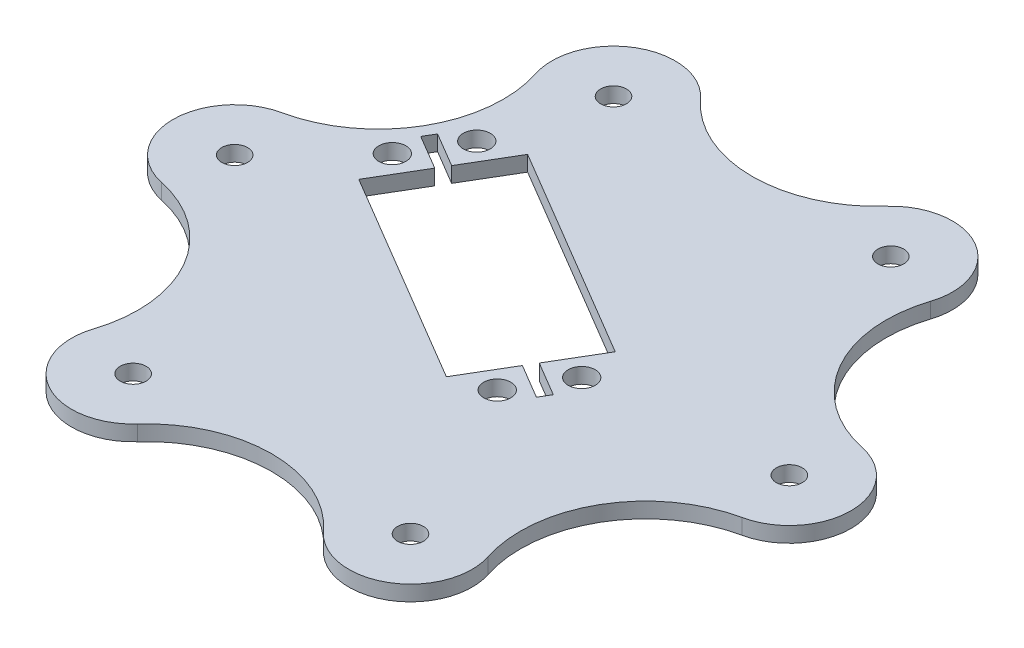
ISO-10303-21;
HEADER;
FILE_DESCRIPTION(('STEP AP214'),'2;1');
FILE_NAME('part.step','',(''),(''),'','','');
FILE_SCHEMA(('AUTOMOTIVE_DESIGN { 1 0 10303 214 1 1 1 1 }'));
ENDSEC;
DATA;
#1=APPLICATION_CONTEXT('core data for automotive mechanical design processes');
#2=APPLICATION_PROTOCOL_DEFINITION('international standard','automotive_design',2000,#1);
#3=PRODUCT_CONTEXT('',#1,'mechanical');
#4=PRODUCT('Part','Part','',(#3));
#5=PRODUCT_RELATED_PRODUCT_CATEGORY('part','',(#4));
#6=PRODUCT_DEFINITION_FORMATION('','',#4);
#7=PRODUCT_DEFINITION_CONTEXT('part definition',#1,'design');
#8=PRODUCT_DEFINITION('design','',#6,#7);
#9=PRODUCT_DEFINITION_SHAPE('','',#8);
#10=(LENGTH_UNIT() NAMED_UNIT(*) SI_UNIT(.MILLI.,.METRE.));
#11=(NAMED_UNIT(*) PLANE_ANGLE_UNIT() SI_UNIT($,.RADIAN.));
#12=(NAMED_UNIT(*) SI_UNIT($,.STERADIAN.) SOLID_ANGLE_UNIT());
#13=UNCERTAINTY_MEASURE_WITH_UNIT(LENGTH_MEASURE(1.E-05),#10,'distance_accuracy_value','');
#14=(GEOMETRIC_REPRESENTATION_CONTEXT(3) GLOBAL_UNCERTAINTY_ASSIGNED_CONTEXT((#13)) GLOBAL_UNIT_ASSIGNED_CONTEXT((#10,
#11,#12)) REPRESENTATION_CONTEXT('',''));
#15=CARTESIAN_POINT('',(0.,0.,0.));
#16=DIRECTION('',(0.,0.,1.));
#17=DIRECTION('',(1.,0.,0.));
#18=AXIS2_PLACEMENT_3D('',#15,#16,#17);
#19=CARTESIAN_POINT('',(-21.3208895512952,-7.5,-23.8559353556927));
#20=DIRECTION('',(-0.860502224298994,0.,-0.509446682172418));
#21=DIRECTION('',(-0.509446682172418,0.,0.860502224298994));
#22=AXIS2_PLACEMENT_3D('',#19,#20,#21);
#23=PLANE('',#22);
#24=DIRECTION('',(-0.509446682172418,0.,0.860502224298994));
#25=VECTOR('',#24,1.);
#26=CARTESIAN_POINT('',(-26.2453178411193,0.,-15.5381238062588));
#27=LINE('',#26,#25);
#28=CARTESIAN_POINT('',(-26.9248030551918,0.,-14.3904108884037));
#29=VERTEX_POINT('',#28);
#30=CARTESIAN_POINT('',(-31.5098231947436,0.,-6.64589086971278));
#31=VERTEX_POINT('',#30);
#32=EDGE_CURVE('E507',#29,#31,#27,.T.);
#33=ORIENTED_EDGE('',*,*,#32,.F.);
#34=DIRECTION('',(0.,1.,0.));
#35=VECTOR('',#34,1.);
#36=CARTESIAN_POINT('',(-26.9248030551918,-7.5,-14.3904108884037));
#37=LINE('',#36,#35);
#38=CARTESIAN_POINT('',(-26.9248030551918,2.5,-14.3904108884037));
#39=VERTEX_POINT('',#38);
#40=EDGE_CURVE('E267',#29,#39,#37,.T.);
#41=ORIENTED_EDGE('',*,*,#40,.T.);
#42=DIRECTION('',(-0.509446682172418,0.,0.860502224298993));
#43=VECTOR('',#42,1.);
#44=CARTESIAN_POINT('',(-21.3208895512952,2.5,-23.8559353556927));
#45=LINE('',#44,#43);
#46=CARTESIAN_POINT('',(-31.5098231947436,2.5,-6.64589086971278));
#47=VERTEX_POINT('',#46);
#48=EDGE_CURVE('E294',#39,#47,#45,.T.);
#49=ORIENTED_EDGE('',*,*,#48,.T.);
#50=DIRECTION('',(0.,1.,0.));
#51=VECTOR('',#50,1.);
#52=CARTESIAN_POINT('',(-31.5098231947436,-7.5,-6.64589086971278));
#53=LINE('',#52,#51);
#54=EDGE_CURVE('E306',#31,#47,#53,.T.);
#55=ORIENTED_EDGE('',*,*,#54,.F.);
#56=EDGE_LOOP('',(#33,#41,#49,#55));
#57=FACE_BOUND('',#56,.T.);
#58=ADVANCED_FACE('F46',(#57),#23,.F.);
#59=CARTESIAN_POINT('',(3.34051688936566,-7.5,13.9866997582702));
#60=DIRECTION('',(0.860502224298993,0.,0.509446682172418));
#61=DIRECTION('',(0.509446682172418,0.,-0.860502224298993));
#62=AXIS2_PLACEMENT_3D('',#59,#60,#61);
#63=PLANE('',#62);
#64=DIRECTION('',(0.509446682172418,0.,-0.860502224298993));
#65=VECTOR('',#64,1.);
#66=CARTESIAN_POINT('',(3.34051688936566,2.5,13.9866997582702));
#67=LINE('',#66,#65);
#68=CARTESIAN_POINT('',(3.34051688936566,2.5,13.9866997582702));
#69=VERTEX_POINT('',#68);
#70=CARTESIAN_POINT('',(7.92553702891743,2.5,6.2421797395792));
#71=VERTEX_POINT('',#70);
#72=EDGE_CURVE('E299',#69,#71,#67,.T.);
#73=ORIENTED_EDGE('',*,*,#72,.T.);
#74=DIRECTION('',(0.,-1.,0.));
#75=VECTOR('',#74,1.);
#76=CARTESIAN_POINT('',(7.92553702891743,-7.5,6.2421797395792));
#77=LINE('',#76,#75);
#78=CARTESIAN_POINT('',(7.92553702891743,0.,6.2421797395792));
#79=VERTEX_POINT('',#78);
#80=EDGE_CURVE('E226',#71,#79,#77,.T.);
#81=ORIENTED_EDGE('',*,*,#80,.T.);
#82=DIRECTION('',(0.509446682172418,0.,-0.860502224298993));
#83=VECTOR('',#82,1.);
#84=CARTESIAN_POINT('',(8.60502224298993,0.,5.09446682172418));
#85=LINE('',#84,#83);
#86=CARTESIAN_POINT('',(3.34051688936566,0.,13.9866997582702));
#87=VERTEX_POINT('',#86);
#88=EDGE_CURVE('E499',#87,#79,#85,.T.);
#89=ORIENTED_EDGE('',*,*,#88,.F.);
#90=DIRECTION('',(0.,1.,0.));
#91=VECTOR('',#90,1.);
#92=CARTESIAN_POINT('',(3.34051688936566,-7.5,13.9866997582702));
#93=LINE('',#92,#91);
#94=EDGE_CURVE('E315',#87,#69,#93,.T.);
#95=ORIENTED_EDGE('',*,*,#94,.T.);
#96=EDGE_LOOP('',(#73,#81,#89,#95));
#97=FACE_BOUND('',#96,.T.);
#98=ADVANCED_FACE('F538',(#97),#63,.F.);
#99=CARTESIAN_POINT('',(-51.3411410143718,2.5,29.6418215851493));
#100=DIRECTION('',(0.,-1.,0.));
#101=DIRECTION('',(0.,0.,-1.));
#102=AXIS2_PLACEMENT_3D('',#99,#100,#101);
#103=CYLINDRICAL_SURFACE('',#102,20.3125000000001);
#104=CARTESIAN_POINT('',(-51.3411410143718,0.,29.6418215851493));
#105=DIRECTION('',(0.,1.,0.));
#106=DIRECTION('',(0.,0.,1.));
#107=AXIS2_PLACEMENT_3D('',#104,#105,#106);
#108=CIRCLE('',#107,20.3125000000001);
#109=CARTESIAN_POINT('',(-32.0146032212363,0.,35.8934288329304));
#110=VERTEX_POINT('',#109);
#111=CARTESIAN_POINT('',(-47.0919228088649,0.,9.77874526520353));
#112=VERTEX_POINT('',#111);
#113=EDGE_CURVE('E365',#110,#112,#108,.T.);
#114=ORIENTED_EDGE('',*,*,#113,.F.);
#115=DIRECTION('',(0.,-1.,0.));
#116=VECTOR('',#115,1.);
#117=CARTESIAN_POINT('',(-32.0146032212363,2.5,35.8934288329304));
#118=LINE('',#117,#116);
#119=CARTESIAN_POINT('',(-32.0146032212363,2.5,35.8934288329304));
#120=VERTEX_POINT('',#119);
#121=EDGE_CURVE('E491',#120,#110,#118,.T.);
#122=ORIENTED_EDGE('',*,*,#121,.F.);
#123=CARTESIAN_POINT('',(-51.3411410143718,2.5,29.6418215851493));
#124=DIRECTION('',(0.,1.,0.));
#125=DIRECTION('',(0.,0.,1.));
#126=AXIS2_PLACEMENT_3D('',#123,#124,#125);
#127=CIRCLE('',#126,20.3125000000001);
#128=CARTESIAN_POINT('',(-47.0919228088649,2.5,9.77874526520353));
#129=VERTEX_POINT('',#128);
#130=EDGE_CURVE('E369',#120,#129,#127,.T.);
#131=ORIENTED_EDGE('',*,*,#130,.T.);
#132=DIRECTION('',(0.,-1.,0.));
#133=VECTOR('',#132,1.);
#134=CARTESIAN_POINT('',(-47.0919228088649,2.5,9.77874526520353));
#135=LINE('',#134,#133);
#136=EDGE_CURVE('E412',#129,#112,#135,.T.);
#137=ORIENTED_EDGE('',*,*,#136,.T.);
#138=EDGE_LOOP('',(#114,#122,#131,#137));
#139=FACE_BOUND('',#138,.T.);
#140=ADVANCED_FACE('F48',(#139),#103,.F.);
#141=CARTESIAN_POINT('',(-22.5000000000004,2.5,38.9711431702995));
#142=DIRECTION('',(0.,-1.,0.));
#143=DIRECTION('',(0.,0.,-1.));
#144=AXIS2_PLACEMENT_3D('',#141,#142,#143);
#145=CYLINDRICAL_SURFACE('',#144,10.);
#146=CARTESIAN_POINT('',(-22.5000000000004,0.,38.9711431702995));
#147=DIRECTION('',(0.,1.,0.));
#148=DIRECTION('',(0.,0.,1.));
#149=AXIS2_PLACEMENT_3D('',#146,#147,#148);
#150=CIRCLE('',#149,10.);
#151=CARTESIAN_POINT('',(-15.0773195876293,0.,45.6721740981347));
#152=VERTEX_POINT('',#151);
#153=EDGE_CURVE('E416',#110,#152,#150,.T.);
#154=ORIENTED_EDGE('',*,*,#153,.T.);
#155=DIRECTION('',(0.,-1.,0.));
#156=VECTOR('',#155,1.);
#157=CARTESIAN_POINT('',(-15.0773195876293,2.5,45.6721740981347));
#158=LINE('',#157,#156);
#159=CARTESIAN_POINT('',(-15.0773195876293,2.5,45.6721740981347));
#160=VERTEX_POINT('',#159);
#161=EDGE_CURVE('E488',#160,#152,#158,.T.);
#162=ORIENTED_EDGE('',*,*,#161,.F.);
#163=CARTESIAN_POINT('',(-22.5000000000004,2.5,38.9711431702995));
#164=DIRECTION('',(0.,1.,0.));
#165=DIRECTION('',(0.,0.,1.));
#166=AXIS2_PLACEMENT_3D('',#163,#164,#165);
#167=CIRCLE('',#166,10.);
#168=EDGE_CURVE('E373',#120,#160,#167,.T.);
#169=ORIENTED_EDGE('',*,*,#168,.F.);
#170=ORIENTED_EDGE('',*,*,#121,.T.);
#171=EDGE_LOOP('',(#154,#162,#169,#170));
#172=FACE_BOUND('',#171,.T.);
#173=ADVANCED_FACE('F666',(#172),#145,.T.);
#174=CARTESIAN_POINT('',(-5.34294830600857E-13,2.5,59.2836431702998));
#175=DIRECTION('',(0.,-1.,0.));
#176=DIRECTION('',(0.,0.,-1.));
#177=AXIS2_PLACEMENT_3D('',#174,#175,#176);
#178=CYLINDRICAL_SURFACE('',#177,20.3125);
#179=CARTESIAN_POINT('',(-5.34294830600857E-13,0.,59.2836431702998));
#180=DIRECTION('',(0.,1.,0.));
#181=DIRECTION('',(0.,0.,1.));
#182=AXIS2_PLACEMENT_3D('',#179,#180,#181);
#183=CIRCLE('',#182,20.3125);
#184=CARTESIAN_POINT('',(15.0773195876285,0.,45.6721740981349));
#185=VERTEX_POINT('',#184);
#186=EDGE_CURVE('E420',#185,#152,#183,.T.);
#187=ORIENTED_EDGE('',*,*,#186,.F.);
#188=DIRECTION('',(0.,-1.,0.));
#189=VECTOR('',#188,1.);
#190=CARTESIAN_POINT('',(15.0773195876285,2.5,45.6721740981349));
#191=LINE('',#190,#189);
#192=CARTESIAN_POINT('',(15.0773195876285,2.5,45.6721740981349));
#193=VERTEX_POINT('',#192);
#194=EDGE_CURVE('E485',#193,#185,#191,.T.);
#195=ORIENTED_EDGE('',*,*,#194,.F.);
#196=CARTESIAN_POINT('',(-5.34294830600857E-13,2.5,59.2836431702998));
#197=DIRECTION('',(0.,1.,0.));
#198=DIRECTION('',(0.,0.,1.));
#199=AXIS2_PLACEMENT_3D('',#196,#197,#198);
#200=CIRCLE('',#199,20.3125);
#201=EDGE_CURVE('E377',#193,#160,#200,.T.);
#202=ORIENTED_EDGE('',*,*,#201,.T.);
#203=ORIENTED_EDGE('',*,*,#161,.T.);
#204=EDGE_LOOP('',(#187,#195,#202,#203));
#205=FACE_BOUND('',#204,.T.);
#206=ADVANCED_FACE('F663',(#205),#178,.F.);
#207=CARTESIAN_POINT('',(22.4999999999997,2.5,38.9711431702999));
#208=DIRECTION('',(0.,-1.,0.));
#209=DIRECTION('',(0.,0.,-1.));
#210=AXIS2_PLACEMENT_3D('',#207,#208,#209);
#211=CYLINDRICAL_SURFACE('',#210,10.);
#212=CARTESIAN_POINT('',(22.4999999999997,0.,38.9711431702999));
#213=DIRECTION('',(0.,1.,0.));
#214=DIRECTION('',(0.,0.,1.));
#215=AXIS2_PLACEMENT_3D('',#212,#213,#214);
#216=CIRCLE('',#215,10.);
#217=CARTESIAN_POINT('',(32.0146032212357,0.,35.8934288329309));
#218=VERTEX_POINT('',#217);
#219=EDGE_CURVE('E424',#185,#218,#216,.T.);
#220=ORIENTED_EDGE('',*,*,#219,.T.);
#221=DIRECTION('',(0.,-1.,0.));
#222=VECTOR('',#221,1.);
#223=CARTESIAN_POINT('',(32.0146032212357,2.5,35.8934288329309));
#224=LINE('',#223,#222);
#225=CARTESIAN_POINT('',(32.0146032212357,2.5,35.8934288329309));
#226=VERTEX_POINT('',#225);
#227=EDGE_CURVE('E482',#226,#218,#224,.T.);
#228=ORIENTED_EDGE('',*,*,#227,.F.);
#229=CARTESIAN_POINT('',(22.4999999999997,2.5,38.9711431702999));
#230=DIRECTION('',(0.,1.,0.));
#231=DIRECTION('',(0.,0.,1.));
#232=AXIS2_PLACEMENT_3D('',#229,#230,#231);
#233=CIRCLE('',#232,10.);
#234=EDGE_CURVE('E381',#193,#226,#233,.T.);
#235=ORIENTED_EDGE('',*,*,#234,.F.);
#236=ORIENTED_EDGE('',*,*,#194,.T.);
#237=EDGE_LOOP('',(#220,#228,#235,#236));
#238=FACE_BOUND('',#237,.T.);
#239=ADVANCED_FACE('F659',(#238),#211,.T.);
#240=CARTESIAN_POINT('',(51.3411410143713,2.5,29.6418215851502));
#241=DIRECTION('',(0.,-1.,0.));
#242=DIRECTION('',(0.,0.,-1.));
#243=AXIS2_PLACEMENT_3D('',#240,#241,#242);
#244=CYLINDRICAL_SURFACE('',#243,20.3125);
#245=CARTESIAN_POINT('',(51.3411410143713,0.,29.6418215851502));
#246=DIRECTION('',(0.,1.,0.));
#247=DIRECTION('',(0.,0.,1.));
#248=AXIS2_PLACEMENT_3D('',#245,#246,#247);
#249=CIRCLE('',#248,20.3125);
#250=CARTESIAN_POINT('',(47.0919228088647,0.,9.77874526520433));
#251=VERTEX_POINT('',#250);
#252=EDGE_CURVE('E428',#251,#218,#249,.T.);
#253=ORIENTED_EDGE('',*,*,#252,.F.);
#254=DIRECTION('',(0.,-1.,0.));
#255=VECTOR('',#254,1.);
#256=CARTESIAN_POINT('',(47.0919228088647,2.5,9.77874526520433));
#257=LINE('',#256,#255);
#258=CARTESIAN_POINT('',(47.0919228088647,2.5,9.77874526520433));
#259=VERTEX_POINT('',#258);
#260=EDGE_CURVE('E479',#259,#251,#257,.T.);
#261=ORIENTED_EDGE('',*,*,#260,.F.);
#262=CARTESIAN_POINT('',(51.3411410143713,2.5,29.6418215851502));
#263=DIRECTION('',(0.,1.,0.));
#264=DIRECTION('',(0.,0.,1.));
#265=AXIS2_PLACEMENT_3D('',#262,#263,#264);
#266=CIRCLE('',#265,20.3125);
#267=EDGE_CURVE('E384',#259,#226,#266,.T.);
#268=ORIENTED_EDGE('',*,*,#267,.T.);
#269=ORIENTED_EDGE('',*,*,#227,.T.);
#270=EDGE_LOOP('',(#253,#261,#268,#269));
#271=FACE_BOUND('',#270,.T.);
#272=ADVANCED_FACE('F655',(#271),#244,.F.);
#273=CARTESIAN_POINT('',(45.,2.5,2.22044604925031E-13));
#274=DIRECTION('',(0.,-1.,0.));
#275=DIRECTION('',(0.,0.,-1.));
#276=AXIS2_PLACEMENT_3D('',#273,#274,#275);
#277=CYLINDRICAL_SURFACE('',#276,10.);
#278=CARTESIAN_POINT('',(45.,0.,2.22044604925031E-13));
#279=DIRECTION('',(0.,1.,0.));
#280=DIRECTION('',(0.,0.,1.));
#281=AXIS2_PLACEMENT_3D('',#278,#279,#280);
#282=CIRCLE('',#281,10.);
#283=CARTESIAN_POINT('',(47.0919228088649,0.,-9.77874526520385));
#284=VERTEX_POINT('',#283);
#285=EDGE_CURVE('E432',#251,#284,#282,.T.);
#286=ORIENTED_EDGE('',*,*,#285,.T.);
#287=DIRECTION('',(0.,-1.,0.));
#288=VECTOR('',#287,1.);
#289=CARTESIAN_POINT('',(47.0919228088649,2.5,-9.77874526520385));
#290=LINE('',#289,#288);
#291=CARTESIAN_POINT('',(47.0919228088649,2.5,-9.77874526520385));
#292=VERTEX_POINT('',#291);
#293=EDGE_CURVE('E476',#292,#284,#290,.T.);
#294=ORIENTED_EDGE('',*,*,#293,.F.);
#295=CARTESIAN_POINT('',(45.,2.5,2.22044604925031E-13));
#296=DIRECTION('',(0.,1.,0.));
#297=DIRECTION('',(0.,0.,1.));
#298=AXIS2_PLACEMENT_3D('',#295,#296,#297);
#299=CIRCLE('',#298,10.);
#300=EDGE_CURVE('E388',#259,#292,#299,.T.);
#301=ORIENTED_EDGE('',*,*,#300,.F.);
#302=ORIENTED_EDGE('',*,*,#260,.T.);
#303=EDGE_LOOP('',(#286,#294,#301,#302));
#304=FACE_BOUND('',#303,.T.);
#305=ADVANCED_FACE('F651',(#304),#277,.T.);
#306=CARTESIAN_POINT('',(51.3411410143716,2.5,-29.6418215851497));
#307=DIRECTION('',(0.,-1.,0.));
#308=DIRECTION('',(0.,0.,-1.));
#309=AXIS2_PLACEMENT_3D('',#306,#307,#308);
#310=CYLINDRICAL_SURFACE('',#309,20.3125000000001);
#311=CARTESIAN_POINT('',(51.3411410143716,0.,-29.6418215851497));
#312=DIRECTION('',(0.,1.,0.));
#313=DIRECTION('',(0.,0.,1.));
#314=AXIS2_PLACEMENT_3D('',#311,#312,#313);
#315=CIRCLE('',#314,20.3125000000001);
#316=CARTESIAN_POINT('',(32.014603221236,0.,-35.8934288329306));
#317=VERTEX_POINT('',#316);
#318=EDGE_CURVE('E436',#317,#284,#315,.T.);
#319=ORIENTED_EDGE('',*,*,#318,.F.);
#320=DIRECTION('',(0.,-1.,0.));
#321=VECTOR('',#320,1.);
#322=CARTESIAN_POINT('',(32.014603221236,2.5,-35.8934288329306));
#323=LINE('',#322,#321);
#324=CARTESIAN_POINT('',(32.014603221236,2.5,-35.8934288329306));
#325=VERTEX_POINT('',#324);
#326=EDGE_CURVE('E473',#325,#317,#323,.T.);
#327=ORIENTED_EDGE('',*,*,#326,.F.);
#328=CARTESIAN_POINT('',(51.3411410143716,2.5,-29.6418215851497));
#329=DIRECTION('',(0.,1.,0.));
#330=DIRECTION('',(0.,0.,1.));
#331=AXIS2_PLACEMENT_3D('',#328,#329,#330);
#332=CIRCLE('',#331,20.3125000000001);
#333=EDGE_CURVE('E391',#325,#292,#332,.T.);
#334=ORIENTED_EDGE('',*,*,#333,.T.);
#335=ORIENTED_EDGE('',*,*,#293,.T.);
#336=EDGE_LOOP('',(#319,#327,#334,#335));
#337=FACE_BOUND('',#336,.T.);
#338=ADVANCED_FACE('F647',(#337),#310,.F.);
#339=CARTESIAN_POINT('',(22.5000000000001,2.5,-38.9711431702997));
#340=DIRECTION('',(0.,-1.,0.));
#341=DIRECTION('',(0.,0.,-1.));
#342=AXIS2_PLACEMENT_3D('',#339,#340,#341);
#343=CYLINDRICAL_SURFACE('',#342,10.);
#344=CARTESIAN_POINT('',(22.5000000000001,0.,-38.9711431702997));
#345=DIRECTION('',(0.,1.,0.));
#346=DIRECTION('',(0.,0.,1.));
#347=AXIS2_PLACEMENT_3D('',#344,#345,#346);
#348=CIRCLE('',#347,10.);
#349=CARTESIAN_POINT('',(15.077319587629,0.,-45.6721740981348));
#350=VERTEX_POINT('',#349);
#351=EDGE_CURVE('E440',#317,#350,#348,.T.);
#352=ORIENTED_EDGE('',*,*,#351,.T.);
#353=DIRECTION('',(0.,-1.,0.));
#354=VECTOR('',#353,1.);
#355=CARTESIAN_POINT('',(15.077319587629,2.5,-45.6721740981348));
#356=LINE('',#355,#354);
#357=CARTESIAN_POINT('',(15.077319587629,2.5,-45.6721740981348));
#358=VERTEX_POINT('',#357);
#359=EDGE_CURVE('E470',#358,#350,#356,.T.);
#360=ORIENTED_EDGE('',*,*,#359,.F.);
#361=CARTESIAN_POINT('',(22.5000000000001,2.5,-38.9711431702997));
#362=DIRECTION('',(0.,1.,0.));
#363=DIRECTION('',(0.,0.,1.));
#364=AXIS2_PLACEMENT_3D('',#361,#362,#363);
#365=CIRCLE('',#364,10.);
#366=EDGE_CURVE('E395',#325,#358,#365,.T.);
#367=ORIENTED_EDGE('',*,*,#366,.F.);
#368=ORIENTED_EDGE('',*,*,#326,.T.);
#369=EDGE_LOOP('',(#352,#360,#367,#368));
#370=FACE_BOUND('',#369,.T.);
#371=ADVANCED_FACE('F643',(#370),#343,.T.);
#372=CARTESIAN_POINT('',(1.21430643318376E-13,2.5,-59.2836431702998));
#373=DIRECTION('',(0.,-1.,0.));
#374=DIRECTION('',(0.,0.,-1.));
#375=AXIS2_PLACEMENT_3D('',#372,#373,#374);
#376=CYLINDRICAL_SURFACE('',#375,20.3125);
#377=CARTESIAN_POINT('',(1.21430643318376E-13,0.,-59.2836431702998));
#378=DIRECTION('',(0.,1.,0.));
#379=DIRECTION('',(0.,0.,1.));
#380=AXIS2_PLACEMENT_3D('',#377,#378,#379);
#381=CIRCLE('',#380,20.3125);
#382=CARTESIAN_POINT('',(-15.0773195876288,0.,-45.6721740981348));
#383=VERTEX_POINT('',#382);
#384=EDGE_CURVE('E444',#383,#350,#381,.T.);
#385=ORIENTED_EDGE('',*,*,#384,.F.);
#386=DIRECTION('',(0.,-1.,0.));
#387=VECTOR('',#386,1.);
#388=CARTESIAN_POINT('',(-15.0773195876288,2.5,-45.6721740981348));
#389=LINE('',#388,#387);
#390=CARTESIAN_POINT('',(-15.0773195876288,2.5,-45.6721740981348));
#391=VERTEX_POINT('',#390);
#392=EDGE_CURVE('E467',#391,#383,#389,.T.);
#393=ORIENTED_EDGE('',*,*,#392,.F.);
#394=CARTESIAN_POINT('',(1.21430643318376E-13,2.5,-59.2836431702998));
#395=DIRECTION('',(0.,1.,0.));
#396=DIRECTION('',(0.,0.,1.));
#397=AXIS2_PLACEMENT_3D('',#394,#395,#396);
#398=CIRCLE('',#397,20.3125);
#399=EDGE_CURVE('E398',#391,#358,#398,.T.);
#400=ORIENTED_EDGE('',*,*,#399,.T.);
#401=ORIENTED_EDGE('',*,*,#359,.T.);
#402=EDGE_LOOP('',(#385,#393,#400,#401));
#403=FACE_BOUND('',#402,.T.);
#404=ADVANCED_FACE('F639',(#403),#376,.F.);
#405=CARTESIAN_POINT('',(-22.5,2.5,-38.9711431702998));
#406=DIRECTION('',(0.,-1.,0.));
#407=DIRECTION('',(0.,0.,-1.));
#408=AXIS2_PLACEMENT_3D('',#405,#406,#407);
#409=CYLINDRICAL_SURFACE('',#408,10.);
#410=CARTESIAN_POINT('',(-22.5,0.,-38.9711431702998));
#411=DIRECTION('',(0.,1.,0.));
#412=DIRECTION('',(0.,0.,1.));
#413=AXIS2_PLACEMENT_3D('',#410,#411,#412);
#414=CIRCLE('',#413,10.);
#415=CARTESIAN_POINT('',(-32.0146032212359,0.,-35.8934288329307));
#416=VERTEX_POINT('',#415);
#417=EDGE_CURVE('E448',#383,#416,#414,.T.);
#418=ORIENTED_EDGE('',*,*,#417,.T.);
#419=DIRECTION('',(0.,-1.,0.));
#420=VECTOR('',#419,1.);
#421=CARTESIAN_POINT('',(-32.0146032212359,2.5,-35.8934288329307));
#422=LINE('',#421,#420);
#423=CARTESIAN_POINT('',(-32.0146032212359,2.5,-35.8934288329307));
#424=VERTEX_POINT('',#423);
#425=EDGE_CURVE('E464',#424,#416,#422,.T.);
#426=ORIENTED_EDGE('',*,*,#425,.F.);
#427=CARTESIAN_POINT('',(-22.5,2.5,-38.9711431702998));
#428=DIRECTION('',(0.,1.,0.));
#429=DIRECTION('',(0.,0.,1.));
#430=AXIS2_PLACEMENT_3D('',#427,#428,#429);
#431=CIRCLE('',#430,10.);
#432=EDGE_CURVE('E402',#391,#424,#431,.T.);
#433=ORIENTED_EDGE('',*,*,#432,.F.);
#434=ORIENTED_EDGE('',*,*,#392,.T.);
#435=EDGE_LOOP('',(#418,#426,#433,#434));
#436=FACE_BOUND('',#435,.T.);
#437=ADVANCED_FACE('F635',(#436),#409,.T.);
#438=CARTESIAN_POINT('',(-51.3411410143715,2.5,-29.6418215851499));
#439=DIRECTION('',(0.,-1.,0.));
#440=DIRECTION('',(0.,0.,-1.));
#441=AXIS2_PLACEMENT_3D('',#438,#439,#440);
#442=CYLINDRICAL_SURFACE('',#441,20.3125);
#443=CARTESIAN_POINT('',(-51.3411410143715,0.,-29.6418215851499));
#444=DIRECTION('',(0.,1.,0.));
#445=DIRECTION('',(0.,0.,1.));
#446=AXIS2_PLACEMENT_3D('',#443,#444,#445);
#447=CIRCLE('',#446,20.3125);
#448=CARTESIAN_POINT('',(-47.0919228088648,0.,-9.77874526520452));
#449=VERTEX_POINT('',#448);
#450=EDGE_CURVE('E452',#449,#416,#447,.T.);
#451=ORIENTED_EDGE('',*,*,#450,.F.);
#452=DIRECTION('',(0.,-1.,0.));
#453=VECTOR('',#452,1.);
#454=CARTESIAN_POINT('',(-47.0919228088648,2.5,-9.77874526520452));
#455=LINE('',#454,#453);
#456=CARTESIAN_POINT('',(-47.0919228088648,2.5,-9.77874526520452));
#457=VERTEX_POINT('',#456);
#458=EDGE_CURVE('E461',#457,#449,#455,.T.);
#459=ORIENTED_EDGE('',*,*,#458,.F.);
#460=CARTESIAN_POINT('',(-51.3411410143715,2.5,-29.6418215851499));
#461=DIRECTION('',(0.,1.,0.));
#462=DIRECTION('',(0.,0.,1.));
#463=AXIS2_PLACEMENT_3D('',#460,#461,#462);
#464=CIRCLE('',#463,20.3125);
#465=EDGE_CURVE('E405',#457,#424,#464,.T.);
#466=ORIENTED_EDGE('',*,*,#465,.T.);
#467=ORIENTED_EDGE('',*,*,#425,.T.);
#468=EDGE_LOOP('',(#451,#459,#466,#467));
#469=FACE_BOUND('',#468,.T.);
#470=ADVANCED_FACE('F631',(#469),#442,.F.);
#471=CARTESIAN_POINT('',(-45.,2.5,-5.27355936696949E-13));
#472=DIRECTION('',(0.,-1.,0.));
#473=DIRECTION('',(0.,0.,-1.));
#474=AXIS2_PLACEMENT_3D('',#471,#472,#473);
#475=CYLINDRICAL_SURFACE('',#474,10.);
#476=CARTESIAN_POINT('',(-45.,0.,-5.27355936696949E-13));
#477=DIRECTION('',(0.,1.,0.));
#478=DIRECTION('',(0.,0.,1.));
#479=AXIS2_PLACEMENT_3D('',#476,#477,#478);
#480=CIRCLE('',#479,10.);
#481=EDGE_CURVE('E374',#449,#112,#480,.T.);
#482=ORIENTED_EDGE('',*,*,#481,.T.);
#483=ORIENTED_EDGE('',*,*,#136,.F.);
#484=CARTESIAN_POINT('',(-45.,2.5,-5.27355936696949E-13));
#485=DIRECTION('',(0.,1.,0.));
#486=DIRECTION('',(0.,0.,1.));
#487=AXIS2_PLACEMENT_3D('',#484,#485,#486);
#488=CIRCLE('',#487,10.);
#489=EDGE_CURVE('E409',#457,#129,#488,.T.);
#490=ORIENTED_EDGE('',*,*,#489,.F.);
#491=ORIENTED_EDGE('',*,*,#458,.T.);
#492=EDGE_LOOP('',(#482,#483,#490,#491));
#493=FACE_BOUND('',#492,.T.);
#494=ADVANCED_FACE('F627',(#493),#475,.T.);
#495=CARTESIAN_POINT('',(0.,2.5,0.));
#496=DIRECTION('',(0.,1.,0.));
#497=DIRECTION('',(0.,0.,1.));
#498=AXIS2_PLACEMENT_3D('',#495,#496,#497);
#499=PLANE('',#498);
#500=DIRECTION('',(0.860502224298994,0.,0.509446682172418));
#501=VECTOR('',#500,1.);
#502=CARTESIAN_POINT('',(-32.5180675131353,2.5,-17.7018143225244));
#503=LINE('',#502,#501);
#504=CARTESIAN_POINT('',(-32.5180675131353,2.5,-17.7018143225244));
#505=VERTEX_POINT('',#504);
#506=EDGE_CURVE('E231',#505,#39,#503,.T.);
#507=ORIENTED_EDGE('',*,*,#506,.F.);
#508=DIRECTION('',(-0.509446682172418,0.,0.860502224298993));
#509=VECTOR('',#508,1.);
#510=CARTESIAN_POINT('',(-32.5180675131353,2.5,-17.7018143225244));
#511=LINE('',#510,#509);
#512=CARTESIAN_POINT('',(-31.4991741487904,2.5,-19.4228187711224));
#513=VERTEX_POINT('',#512);
#514=EDGE_CURVE('E220',#513,#505,#511,.T.);
#515=ORIENTED_EDGE('',*,*,#514,.F.);
#516=DIRECTION('',(-0.860502224298993,0.,-0.509446682172419));
#517=VECTOR('',#516,1.);
#518=CARTESIAN_POINT('',(-31.4991741487904,2.5,-19.4228187711224));
#519=LINE('',#518,#517);
#520=CARTESIAN_POINT('',(-25.905909690847,2.5,-16.1114153370017));
#521=VERTEX_POINT('',#520);
#522=EDGE_CURVE('E238',#521,#513,#519,.T.);
#523=ORIENTED_EDGE('',*,*,#522,.F.);
#524=CARTESIAN_POINT('',(-21.3208895512952,2.5,-23.8559353556927));
#525=VERTEX_POINT('',#524);
#526=EDGE_CURVE('E289',#525,#521,#45,.T.);
#527=ORIENTED_EDGE('',*,*,#526,.F.);
#528=DIRECTION('',(-0.860502224298993,0.,-0.509446682172418));
#529=VECTOR('',#528,1.);
#530=CARTESIAN_POINT('',(-21.3208895512952,2.5,-23.8559353556927));
#531=LINE('',#530,#529);
#532=CARTESIAN_POINT('',(13.529450532814,2.5,-3.22334472770971));
#533=VERTEX_POINT('',#532);
#534=EDGE_CURVE('E302',#533,#525,#531,.T.);
#535=ORIENTED_EDGE('',*,*,#534,.F.);
#536=CARTESIAN_POINT('',(8.94443039326225,2.5,4.52117529098125));
#537=VERTEX_POINT('',#536);
#538=EDGE_CURVE('E298',#537,#533,#67,.T.);
#539=ORIENTED_EDGE('',*,*,#538,.F.);
#540=CARTESIAN_POINT('',(14.5376948512057,2.5,7.83257872510197));
#541=VERTEX_POINT('',#540);
#542=EDGE_CURVE('E70',#541,#537,#519,.T.);
#543=ORIENTED_EDGE('',*,*,#542,.F.);
#544=DIRECTION('',(0.509446682172418,0.,-0.860502224298993));
#545=VECTOR('',#544,1.);
#546=CARTESIAN_POINT('',(14.5376948512057,2.5,7.83257872510197));
#547=LINE('',#546,#545);
#548=CARTESIAN_POINT('',(13.5188014868609,2.5,9.55358317369992));
#549=VERTEX_POINT('',#548);
#550=EDGE_CURVE('E214',#549,#541,#547,.T.);
#551=ORIENTED_EDGE('',*,*,#550,.F.);
#552=EDGE_CURVE('E223',#71,#549,#503,.T.);
#553=ORIENTED_EDGE('',*,*,#552,.F.);
#554=ORIENTED_EDGE('',*,*,#72,.F.);
#555=DIRECTION('',(0.860502224298993,0.,0.509446682172418));
#556=VECTOR('',#555,1.);
#557=CARTESIAN_POINT('',(-31.5098231947436,2.5,-6.64589086971278));
#558=LINE('',#557,#556);
#559=EDGE_CURVE('E293',#47,#69,#558,.T.);
#560=ORIENTED_EDGE('',*,*,#559,.F.);
#561=ORIENTED_EDGE('',*,*,#48,.F.);
#562=EDGE_LOOP('',(#507,#515,#523,#527,#535,#539,#543,#551,#553,#554,#560,#561));
#563=FACE_BOUND('',#562,.T.);
#564=CARTESIAN_POINT('',(14.4242260191479,2.5,3.11695312247493));
#565=DIRECTION('',(0.,1.,0.));
#566=DIRECTION('',(0.,0.,1.));
#567=AXIS2_PLACEMENT_3D('',#564,#565,#566);
#568=CIRCLE('',#567,2.2);
#569=CARTESIAN_POINT('',(14.4242260191479,2.5,5.31695312247493));
#570=VERTEX_POINT('',#569);
#571=EDGE_CURVE('E272',#570,#570,#568,.T.);
#572=ORIENTED_EDGE('',*,*,#571,.F.);
#573=EDGE_LOOP('',(#572));
#574=FACE_BOUND('',#573,.T.);
#575=CARTESIAN_POINT('',(9.32975919742372,2.5,11.7219753654649));
#576=DIRECTION('',(0.,1.,0.));
#577=DIRECTION('',(0.,0.,1.));
#578=AXIS2_PLACEMENT_3D('',#575,#576,#577);
#579=CIRCLE('',#578,2.2);
#580=CARTESIAN_POINT('',(9.32975919742372,2.5,13.9219753654649));
#581=VERTEX_POINT('',#580);
#582=EDGE_CURVE('E277',#581,#581,#579,.T.);
#583=ORIENTED_EDGE('',*,*,#582,.F.);
#584=EDGE_LOOP('',(#583));
#585=FACE_BOUND('',#584,.T.);
#586=CARTESIAN_POINT('',(-27.3101318593533,2.5,-21.5912109628874));
#587=DIRECTION('',(0.,1.,0.));
#588=DIRECTION('',(0.,0.,1.));
#589=AXIS2_PLACEMENT_3D('',#586,#587,#588);
#590=CIRCLE('',#589,2.2);
#591=CARTESIAN_POINT('',(-27.3101318593533,2.5,-19.3912109628874));
#592=VERTEX_POINT('',#591);
#593=EDGE_CURVE('E281',#592,#592,#590,.T.);
#594=ORIENTED_EDGE('',*,*,#593,.F.);
#595=EDGE_LOOP('',(#594));
#596=FACE_BOUND('',#595,.T.);
#597=CARTESIAN_POINT('',(-32.4045986810775,2.5,-12.9861887198974));
#598=DIRECTION('',(0.,1.,0.));
#599=DIRECTION('',(0.,0.,1.));
#600=AXIS2_PLACEMENT_3D('',#597,#598,#599);
#601=CIRCLE('',#600,2.2);
#602=CARTESIAN_POINT('',(-32.4045986810775,2.5,-10.7861887198974));
#603=VERTEX_POINT('',#602);
#604=EDGE_CURVE('E285',#603,#603,#601,.T.);
#605=ORIENTED_EDGE('',*,*,#604,.F.);
#606=EDGE_LOOP('',(#605));
#607=FACE_BOUND('',#606,.T.);
#608=CARTESIAN_POINT('',(-45.,2.5,-5.30825383648903E-13));
#609=DIRECTION('',(0.,1.,0.));
#610=DIRECTION('',(0.,0.,1.));
#611=AXIS2_PLACEMENT_3D('',#608,#609,#610);
#612=CIRCLE('',#611,2.1);
#613=CARTESIAN_POINT('',(-45.,2.5,2.09999999999947));
#614=VERTEX_POINT('',#613);
#615=EDGE_CURVE('E354',#614,#614,#612,.T.);
#616=ORIENTED_EDGE('',*,*,#615,.F.);
#617=EDGE_LOOP('',(#616));
#618=FACE_BOUND('',#617,.T.);
#619=CARTESIAN_POINT('',(-22.5000000000004,2.5,38.9711431702995));
#620=DIRECTION('',(0.,1.,0.));
#621=DIRECTION('',(0.,0.,1.));
#622=AXIS2_PLACEMENT_3D('',#619,#620,#621);
#623=CIRCLE('',#622,2.1);
#624=CARTESIAN_POINT('',(-22.5000000000004,2.5,41.0711431702995));
#625=VERTEX_POINT('',#624);
#626=EDGE_CURVE('E346',#625,#625,#623,.T.);
#627=ORIENTED_EDGE('',*,*,#626,.F.);
#628=EDGE_LOOP('',(#627));
#629=FACE_BOUND('',#628,.T.);
#630=CARTESIAN_POINT('',(22.4999999999997,2.5,38.9711431702999));
#631=DIRECTION('',(0.,1.,0.));
#632=DIRECTION('',(0.,0.,1.));
#633=AXIS2_PLACEMENT_3D('',#630,#631,#632);
#634=CIRCLE('',#633,2.1);
#635=CARTESIAN_POINT('',(22.4999999999997,2.5,41.0711431702999));
#636=VERTEX_POINT('',#635);
#637=EDGE_CURVE('E338',#636,#636,#634,.T.);
#638=ORIENTED_EDGE('',*,*,#637,.F.);
#639=EDGE_LOOP('',(#638));
#640=FACE_BOUND('',#639,.T.);
#641=CARTESIAN_POINT('',(45.,2.5,2.15105711021124E-13));
#642=DIRECTION('',(0.,1.,0.));
#643=DIRECTION('',(0.,0.,1.));
#644=AXIS2_PLACEMENT_3D('',#641,#642,#643);
#645=CIRCLE('',#644,2.1);
#646=CARTESIAN_POINT('',(45.,2.5,2.10000000000021));
#647=VERTEX_POINT('',#646);
#648=EDGE_CURVE('E330',#647,#647,#645,.T.);
#649=ORIENTED_EDGE('',*,*,#648,.F.);
#650=EDGE_LOOP('',(#649));
#651=FACE_BOUND('',#650,.T.);
#652=CARTESIAN_POINT('',(22.5000000000001,2.5,-38.9711431702997));
#653=DIRECTION('',(0.,1.,0.));
#654=DIRECTION('',(0.,0.,1.));
#655=AXIS2_PLACEMENT_3D('',#652,#653,#654);
#656=CIRCLE('',#655,2.1);
#657=CARTESIAN_POINT('',(22.5000000000001,2.5,-36.8711431702997));
#658=VERTEX_POINT('',#657);
#659=EDGE_CURVE('E321',#658,#658,#656,.T.);
#660=ORIENTED_EDGE('',*,*,#659,.F.);
#661=EDGE_LOOP('',(#660));
#662=FACE_BOUND('',#661,.T.);
#663=CARTESIAN_POINT('',(-22.5,2.5,-38.9711431702997));
#664=DIRECTION('',(0.,1.,0.));
#665=DIRECTION('',(0.,0.,1.));
#666=AXIS2_PLACEMENT_3D('',#663,#664,#665);
#667=CIRCLE('',#666,2.1);
#668=CARTESIAN_POINT('',(-22.5,2.5,-36.8711431702997));
#669=VERTEX_POINT('',#668);
#670=EDGE_CURVE('E325',#669,#669,#667,.T.);
#671=ORIENTED_EDGE('',*,*,#670,.F.);
#672=EDGE_LOOP('',(#671));
#673=FACE_BOUND('',#672,.T.);
#674=ORIENTED_EDGE('',*,*,#130,.F.);
#675=ORIENTED_EDGE('',*,*,#168,.T.);
#676=ORIENTED_EDGE('',*,*,#201,.F.);
#677=ORIENTED_EDGE('',*,*,#234,.T.);
#678=ORIENTED_EDGE('',*,*,#267,.F.);
#679=ORIENTED_EDGE('',*,*,#300,.T.);
#680=ORIENTED_EDGE('',*,*,#333,.F.);
#681=ORIENTED_EDGE('',*,*,#366,.T.);
#682=ORIENTED_EDGE('',*,*,#399,.F.);
#683=ORIENTED_EDGE('',*,*,#432,.T.);
#684=ORIENTED_EDGE('',*,*,#465,.F.);
#685=ORIENTED_EDGE('',*,*,#489,.T.);
#686=EDGE_LOOP('',(#674,#675,#676,#677,#678,#679,#680,#681,#682,#683,#684,#685));
#687=FACE_BOUND('',#686,.T.);
#688=ADVANCED_FACE('F234',(#563,#574,#585,#596,#607,#618,#629,#640,#651,#662,#673,#687),#499,.T.);
#689=CARTESIAN_POINT('',(0.,0.,0.));
#690=DIRECTION('',(0.,1.,0.));
#691=DIRECTION('',(0.,0.,1.));
#692=AXIS2_PLACEMENT_3D('',#689,#690,#691);
#693=PLANE('',#692);
#694=DIRECTION('',(-0.509446682172418,0.,0.860502224298993));
#695=VECTOR('',#694,1.);
#696=CARTESIAN_POINT('',(-31.8385822990628,0.,-18.8495272403795));
#697=LINE('',#696,#695);
#698=CARTESIAN_POINT('',(-31.4991741487904,0.,-19.4228187711224));
#699=VERTEX_POINT('',#698);
#700=CARTESIAN_POINT('',(-32.5180675131353,0.,-17.7018143225244));
#701=VERTEX_POINT('',#700);
#702=EDGE_CURVE('E11',#699,#701,#697,.T.);
#703=ORIENTED_EDGE('',*,*,#702,.T.);
#704=DIRECTION('',(0.860502224298994,0.,0.509446682172418));
#705=VECTOR('',#704,1.);
#706=CARTESIAN_POINT('',(-0.679485214072503,0.,1.14771291785502));
#707=LINE('',#706,#705);
#708=EDGE_CURVE('E268',#701,#29,#707,.T.);
#709=ORIENTED_EDGE('',*,*,#708,.T.);
#710=ORIENTED_EDGE('',*,*,#32,.T.);
#711=DIRECTION('',(0.860502224298993,0.,0.509446682172418));
#712=VECTOR('',#711,1.);
#713=CARTESIAN_POINT('',(-5.26450535362427,0.,8.89223293654598));
#714=LINE('',#713,#712);
#715=EDGE_CURVE('E494',#31,#87,#714,.T.);
#716=ORIENTED_EDGE('',*,*,#715,.T.);
#717=ORIENTED_EDGE('',*,*,#88,.T.);
#718=CARTESIAN_POINT('',(13.5188014868609,0.,9.55358317369992));
#719=VERTEX_POINT('',#718);
#720=EDGE_CURVE('E264',#79,#719,#707,.T.);
#721=ORIENTED_EDGE('',*,*,#720,.T.);
#722=DIRECTION('',(0.509446682172418,0.,-0.860502224298993));
#723=VECTOR('',#722,1.);
#724=CARTESIAN_POINT('',(14.1982867009334,0.,8.4058702558449));
#725=LINE('',#724,#723);
#726=CARTESIAN_POINT('',(14.5376948512057,0.,7.83257872510197));
#727=VERTEX_POINT('',#726);
#728=EDGE_CURVE('E55',#719,#727,#725,.T.);
#729=ORIENTED_EDGE('',*,*,#728,.T.);
#730=DIRECTION('',(-0.860502224298993,0.,-0.509446682172419));
#731=VECTOR('',#730,1.);
#732=CARTESIAN_POINT('',(0.339408150272318,0.,-0.573291530742937));
#733=LINE('',#732,#731);
#734=CARTESIAN_POINT('',(8.94443039326225,0.,4.52117529098124));
#735=VERTEX_POINT('',#734);
#736=EDGE_CURVE('E252',#727,#735,#733,.T.);
#737=ORIENTED_EDGE('',*,*,#736,.T.);
#738=CARTESIAN_POINT('',(13.529450532814,0.,-3.22334472770971));
#739=VERTEX_POINT('',#738);
#740=EDGE_CURVE('E498',#735,#739,#85,.T.);
#741=ORIENTED_EDGE('',*,*,#740,.T.);
#742=DIRECTION('',(-0.860502224298993,0.,-0.509446682172418));
#743=VECTOR('',#742,1.);
#744=CARTESIAN_POINT('',(4.92442828982409,0.,-8.31781154943389));
#745=LINE('',#744,#743);
#746=CARTESIAN_POINT('',(-21.3208895512952,0.,-23.8559353556927));
#747=VERTEX_POINT('',#746);
#748=EDGE_CURVE('E503',#739,#747,#745,.T.);
#749=ORIENTED_EDGE('',*,*,#748,.T.);
#750=CARTESIAN_POINT('',(-25.905909690847,0.,-16.1114153370017));
#751=VERTEX_POINT('',#750);
#752=EDGE_CURVE('E508',#747,#751,#27,.T.);
#753=ORIENTED_EDGE('',*,*,#752,.T.);
#754=EDGE_CURVE('E62',#751,#699,#733,.T.);
#755=ORIENTED_EDGE('',*,*,#754,.T.);
#756=EDGE_LOOP('',(#703,#709,#710,#716,#717,#721,#729,#737,#741,#749,#753,#755));
#757=FACE_BOUND('',#756,.T.);
#758=CARTESIAN_POINT('',(14.4242260191479,0.,3.11695312247493));
#759=DIRECTION('',(0.,1.,0.));
#760=DIRECTION('',(0.,0.,1.));
#761=AXIS2_PLACEMENT_3D('',#758,#759,#760);
#762=CIRCLE('',#761,2.2);
#763=CARTESIAN_POINT('',(14.4242260191479,0.,5.31695312247493));
#764=VERTEX_POINT('',#763);
#765=EDGE_CURVE('E524',#764,#764,#762,.T.);
#766=ORIENTED_EDGE('',*,*,#765,.T.);
#767=EDGE_LOOP('',(#766));
#768=FACE_BOUND('',#767,.T.);
#769=CARTESIAN_POINT('',(9.32975919742372,0.,11.7219753654649));
#770=DIRECTION('',(0.,1.,0.));
#771=DIRECTION('',(0.,0.,1.));
#772=AXIS2_PLACEMENT_3D('',#769,#770,#771);
#773=CIRCLE('',#772,2.2);
#774=CARTESIAN_POINT('',(9.32975919742372,0.,13.9219753654649));
#775=VERTEX_POINT('',#774);
#776=EDGE_CURVE('E520',#775,#775,#773,.T.);
#777=ORIENTED_EDGE('',*,*,#776,.T.);
#778=EDGE_LOOP('',(#777));
#779=FACE_BOUND('',#778,.T.);
#780=CARTESIAN_POINT('',(-27.3101318593533,0.,-21.5912109628874));
#781=DIRECTION('',(0.,1.,0.));
#782=DIRECTION('',(0.,0.,1.));
#783=AXIS2_PLACEMENT_3D('',#780,#781,#782);
#784=CIRCLE('',#783,2.2);
#785=CARTESIAN_POINT('',(-27.3101318593533,0.,-19.3912109628874));
#786=VERTEX_POINT('',#785);
#787=EDGE_CURVE('E516',#786,#786,#784,.T.);
#788=ORIENTED_EDGE('',*,*,#787,.T.);
#789=EDGE_LOOP('',(#788));
#790=FACE_BOUND('',#789,.T.);
#791=CARTESIAN_POINT('',(-32.4045986810775,0.,-12.9861887198974));
#792=DIRECTION('',(0.,1.,0.));
#793=DIRECTION('',(0.,0.,1.));
#794=AXIS2_PLACEMENT_3D('',#791,#792,#793);
#795=CIRCLE('',#794,2.2);
#796=CARTESIAN_POINT('',(-32.4045986810775,0.,-10.7861887198974));
#797=VERTEX_POINT('',#796);
#798=EDGE_CURVE('E276',#797,#797,#795,.T.);
#799=ORIENTED_EDGE('',*,*,#798,.T.);
#800=EDGE_LOOP('',(#799));
#801=FACE_BOUND('',#800,.T.);
#802=CARTESIAN_POINT('',(-45.,0.,-5.30825383648903E-13));
#803=DIRECTION('',(0.,1.,0.));
#804=DIRECTION('',(0.,0.,1.));
#805=AXIS2_PLACEMENT_3D('',#802,#803,#804);
#806=CIRCLE('',#805,2.1);
#807=CARTESIAN_POINT('',(-45.,0.,2.09999999999947));
#808=VERTEX_POINT('',#807);
#809=EDGE_CURVE('E310',#808,#808,#806,.T.);
#810=ORIENTED_EDGE('',*,*,#809,.T.);
#811=EDGE_LOOP('',(#810));
#812=FACE_BOUND('',#811,.T.);
#813=CARTESIAN_POINT('',(-22.5000000000004,0.,38.9711431702995));
#814=DIRECTION('',(0.,1.,0.));
#815=DIRECTION('',(0.,0.,1.));
#816=AXIS2_PLACEMENT_3D('',#813,#814,#815);
#817=CIRCLE('',#816,2.1);
#818=CARTESIAN_POINT('',(-22.5000000000004,0.,41.0711431702995));
#819=VERTEX_POINT('',#818);
#820=EDGE_CURVE('E350',#819,#819,#817,.T.);
#821=ORIENTED_EDGE('',*,*,#820,.T.);
#822=EDGE_LOOP('',(#821));
#823=FACE_BOUND('',#822,.T.);
#824=CARTESIAN_POINT('',(22.4999999999997,0.,38.9711431702999));
#825=DIRECTION('',(0.,1.,0.));
#826=DIRECTION('',(0.,0.,1.));
#827=AXIS2_PLACEMENT_3D('',#824,#825,#826);
#828=CIRCLE('',#827,2.1);
#829=CARTESIAN_POINT('',(22.4999999999997,0.,41.0711431702999));
#830=VERTEX_POINT('',#829);
#831=EDGE_CURVE('E342',#830,#830,#828,.T.);
#832=ORIENTED_EDGE('',*,*,#831,.T.);
#833=EDGE_LOOP('',(#832));
#834=FACE_BOUND('',#833,.T.);
#835=CARTESIAN_POINT('',(45.,0.,2.15105711021124E-13));
#836=DIRECTION('',(0.,1.,0.));
#837=DIRECTION('',(0.,0.,1.));
#838=AXIS2_PLACEMENT_3D('',#835,#836,#837);
#839=CIRCLE('',#838,2.1);
#840=CARTESIAN_POINT('',(45.,0.,2.10000000000021));
#841=VERTEX_POINT('',#840);
#842=EDGE_CURVE('E334',#841,#841,#839,.T.);
#843=ORIENTED_EDGE('',*,*,#842,.T.);
#844=EDGE_LOOP('',(#843));
#845=FACE_BOUND('',#844,.T.);
#846=CARTESIAN_POINT('',(22.5000000000001,0.,-38.9711431702997));
#847=DIRECTION('',(0.,1.,0.));
#848=DIRECTION('',(0.,0.,1.));
#849=AXIS2_PLACEMENT_3D('',#846,#847,#848);
#850=CIRCLE('',#849,2.1);
#851=CARTESIAN_POINT('',(22.5000000000001,0.,-36.8711431702997));
#852=VERTEX_POINT('',#851);
#853=EDGE_CURVE('E326',#852,#852,#850,.T.);
#854=ORIENTED_EDGE('',*,*,#853,.T.);
#855=EDGE_LOOP('',(#854));
#856=FACE_BOUND('',#855,.T.);
#857=CARTESIAN_POINT('',(-22.5,0.,-38.9711431702997));
#858=DIRECTION('',(0.,1.,0.));
#859=DIRECTION('',(0.,0.,1.));
#860=AXIS2_PLACEMENT_3D('',#857,#858,#859);
#861=CIRCLE('',#860,2.1);
#862=CARTESIAN_POINT('',(-22.5,0.,-36.8711431702997));
#863=VERTEX_POINT('',#862);
#864=EDGE_CURVE('E361',#863,#863,#861,.T.);
#865=ORIENTED_EDGE('',*,*,#864,.T.);
#866=EDGE_LOOP('',(#865));
#867=FACE_BOUND('',#866,.T.);
#868=ORIENTED_EDGE('',*,*,#113,.T.);
#869=ORIENTED_EDGE('',*,*,#481,.F.);
#870=ORIENTED_EDGE('',*,*,#450,.T.);
#871=ORIENTED_EDGE('',*,*,#417,.F.);
#872=ORIENTED_EDGE('',*,*,#384,.T.);
#873=ORIENTED_EDGE('',*,*,#351,.F.);
#874=ORIENTED_EDGE('',*,*,#318,.T.);
#875=ORIENTED_EDGE('',*,*,#285,.F.);
#876=ORIENTED_EDGE('',*,*,#252,.T.);
#877=ORIENTED_EDGE('',*,*,#219,.F.);
#878=ORIENTED_EDGE('',*,*,#186,.T.);
#879=ORIENTED_EDGE('',*,*,#153,.F.);
#880=EDGE_LOOP('',(#868,#869,#870,#871,#872,#873,#874,#875,#876,#877,#878,#879));
#881=FACE_BOUND('',#880,.T.);
#882=ADVANCED_FACE('F533',(#757,#768,#779,#790,#801,#812,#823,#834,#845,#856,#867,#881),#693,.F.);
#883=CARTESIAN_POINT('',(-22.5,0.,-38.9711431702997));
#884=DIRECTION('',(0.,1.,0.));
#885=DIRECTION('',(0.,0.,1.));
#886=AXIS2_PLACEMENT_3D('',#883,#884,#885);
#887=CYLINDRICAL_SURFACE('',#886,2.1);
#888=ORIENTED_EDGE('',*,*,#864,.F.);
#889=EDGE_LOOP('',(#888));
#890=FACE_BOUND('',#889,.T.);
#891=ORIENTED_EDGE('',*,*,#670,.T.);
#892=EDGE_LOOP('',(#891));
#893=FACE_BOUND('',#892,.T.);
#894=ADVANCED_FACE('F620',(#890,#893),#887,.F.);
#895=CARTESIAN_POINT('',(22.5000000000001,0.,-38.9711431702997));
#896=DIRECTION('',(0.,1.,0.));
#897=DIRECTION('',(0.,0.,1.));
#898=AXIS2_PLACEMENT_3D('',#895,#896,#897);
#899=CYLINDRICAL_SURFACE('',#898,2.1);
#900=ORIENTED_EDGE('',*,*,#853,.F.);
#901=EDGE_LOOP('',(#900));
#902=FACE_BOUND('',#901,.T.);
#903=ORIENTED_EDGE('',*,*,#659,.T.);
#904=EDGE_LOOP('',(#903));
#905=FACE_BOUND('',#904,.T.);
#906=ADVANCED_FACE('F623',(#902,#905),#899,.F.);
#907=CARTESIAN_POINT('',(45.,0.,2.15105711021124E-13));
#908=DIRECTION('',(0.,1.,0.));
#909=DIRECTION('',(0.,0.,1.));
#910=AXIS2_PLACEMENT_3D('',#907,#908,#909);
#911=CYLINDRICAL_SURFACE('',#910,2.1);
#912=ORIENTED_EDGE('',*,*,#842,.F.);
#913=EDGE_LOOP('',(#912));
#914=FACE_BOUND('',#913,.T.);
#915=ORIENTED_EDGE('',*,*,#648,.T.);
#916=EDGE_LOOP('',(#915));
#917=FACE_BOUND('',#916,.T.);
#918=ADVANCED_FACE('F804',(#914,#917),#911,.F.);
#919=CARTESIAN_POINT('',(22.4999999999997,0.,38.9711431702999));
#920=DIRECTION('',(0.,1.,0.));
#921=DIRECTION('',(0.,0.,1.));
#922=AXIS2_PLACEMENT_3D('',#919,#920,#921);
#923=CYLINDRICAL_SURFACE('',#922,2.1);
#924=ORIENTED_EDGE('',*,*,#831,.F.);
#925=EDGE_LOOP('',(#924));
#926=FACE_BOUND('',#925,.T.);
#927=ORIENTED_EDGE('',*,*,#637,.T.);
#928=EDGE_LOOP('',(#927));
#929=FACE_BOUND('',#928,.T.);
#930=ADVANCED_FACE('F613',(#926,#929),#923,.F.);
#931=CARTESIAN_POINT('',(-22.5000000000004,0.,38.9711431702995));
#932=DIRECTION('',(0.,1.,0.));
#933=DIRECTION('',(0.,0.,1.));
#934=AXIS2_PLACEMENT_3D('',#931,#932,#933);
#935=CYLINDRICAL_SURFACE('',#934,2.1);
#936=ORIENTED_EDGE('',*,*,#820,.F.);
#937=EDGE_LOOP('',(#936));
#938=FACE_BOUND('',#937,.T.);
#939=ORIENTED_EDGE('',*,*,#626,.T.);
#940=EDGE_LOOP('',(#939));
#941=FACE_BOUND('',#940,.T.);
#942=ADVANCED_FACE('F607',(#938,#941),#935,.F.);
#943=CARTESIAN_POINT('',(-45.,0.,-5.30825383648903E-13));
#944=DIRECTION('',(0.,1.,0.));
#945=DIRECTION('',(0.,0.,1.));
#946=AXIS2_PLACEMENT_3D('',#943,#944,#945);
#947=CYLINDRICAL_SURFACE('',#946,2.1);
#948=ORIENTED_EDGE('',*,*,#809,.F.);
#949=EDGE_LOOP('',(#948));
#950=FACE_BOUND('',#949,.T.);
#951=ORIENTED_EDGE('',*,*,#615,.T.);
#952=EDGE_LOOP('',(#951));
#953=FACE_BOUND('',#952,.T.);
#954=ADVANCED_FACE('F599',(#950,#953),#947,.F.);
#955=ORIENTED_EDGE('',*,*,#526,.T.);
#956=DIRECTION('',(0.,-1.,0.));
#957=VECTOR('',#956,1.);
#958=CARTESIAN_POINT('',(-25.905909690847,-7.5,-16.1114153370017));
#959=LINE('',#958,#957);
#960=EDGE_CURVE('E261',#521,#751,#959,.T.);
#961=ORIENTED_EDGE('',*,*,#960,.T.);
#962=ORIENTED_EDGE('',*,*,#752,.F.);
#963=DIRECTION('',(0.,1.,0.));
#964=VECTOR('',#963,1.);
#965=CARTESIAN_POINT('',(-21.3208895512952,-7.5,-23.8559353556927));
#966=LINE('',#965,#964);
#967=EDGE_CURVE('E307',#747,#525,#966,.T.);
#968=ORIENTED_EDGE('',*,*,#967,.T.);
#969=EDGE_LOOP('',(#955,#961,#962,#968));
#970=FACE_BOUND('',#969,.T.);
#971=ADVANCED_FACE('F554',(#970),#23,.F.);
#972=CARTESIAN_POINT('',(-21.3208895512952,-7.5,-23.8559353556927));
#973=DIRECTION('',(0.509446682172418,0.,-0.860502224298993));
#974=DIRECTION('',(-0.860502224298993,0.,-0.509446682172418));
#975=AXIS2_PLACEMENT_3D('',#972,#973,#974);
#976=PLANE('',#975);
#977=DIRECTION('',(0.,1.,0.));
#978=VECTOR('',#977,1.);
#979=CARTESIAN_POINT('',(13.529450532814,-7.5,-3.22334472770971));
#980=LINE('',#979,#978);
#981=EDGE_CURVE('E311',#739,#533,#980,.T.);
#982=ORIENTED_EDGE('',*,*,#981,.T.);
#983=ORIENTED_EDGE('',*,*,#534,.T.);
#984=ORIENTED_EDGE('',*,*,#967,.F.);
#985=ORIENTED_EDGE('',*,*,#748,.F.);
#986=EDGE_LOOP('',(#982,#983,#984,#985));
#987=FACE_BOUND('',#986,.T.);
#988=ADVANCED_FACE('F556',(#987),#976,.F.);
#989=ORIENTED_EDGE('',*,*,#740,.F.);
#990=DIRECTION('',(0.,1.,0.));
#991=VECTOR('',#990,1.);
#992=CARTESIAN_POINT('',(8.94443039326225,-7.5,4.52117529098124));
#993=LINE('',#992,#991);
#994=EDGE_CURVE('E512',#735,#537,#993,.T.);
#995=ORIENTED_EDGE('',*,*,#994,.T.);
#996=ORIENTED_EDGE('',*,*,#538,.T.);
#997=ORIENTED_EDGE('',*,*,#981,.F.);
#998=EDGE_LOOP('',(#989,#995,#996,#997));
#999=FACE_BOUND('',#998,.T.);
#1000=ADVANCED_FACE('F572',(#999),#63,.F.);
#1001=CARTESIAN_POINT('',(-31.5098231947436,-7.5,-6.64589086971278));
#1002=DIRECTION('',(-0.509446682172418,0.,0.860502224298993));
#1003=DIRECTION('',(0.860502224298993,0.,0.509446682172418));
#1004=AXIS2_PLACEMENT_3D('',#1001,#1002,#1003);
#1005=PLANE('',#1004);
#1006=ORIENTED_EDGE('',*,*,#54,.T.);
#1007=ORIENTED_EDGE('',*,*,#559,.T.);
#1008=ORIENTED_EDGE('',*,*,#94,.F.);
#1009=ORIENTED_EDGE('',*,*,#715,.F.);
#1010=EDGE_LOOP('',(#1006,#1007,#1008,#1009));
#1011=FACE_BOUND('',#1010,.T.);
#1012=ADVANCED_FACE('F542',(#1011),#1005,.F.);
#1013=CARTESIAN_POINT('',(-32.4045986810775,-7.5,-12.9861887198974));
#1014=DIRECTION('',(0.,1.,0.));
#1015=DIRECTION('',(0.,0.,1.));
#1016=AXIS2_PLACEMENT_3D('',#1013,#1014,#1015);
#1017=CYLINDRICAL_SURFACE('',#1016,2.2);
#1018=ORIENTED_EDGE('',*,*,#604,.T.);
#1019=EDGE_LOOP('',(#1018));
#1020=FACE_BOUND('',#1019,.T.);
#1021=ORIENTED_EDGE('',*,*,#798,.F.);
#1022=EDGE_LOOP('',(#1021));
#1023=FACE_BOUND('',#1022,.T.);
#1024=ADVANCED_FACE('F855',(#1020,#1023),#1017,.F.);
#1025=CARTESIAN_POINT('',(-27.3101318593533,-7.5,-21.5912109628874));
#1026=DIRECTION('',(0.,1.,0.));
#1027=DIRECTION('',(0.,0.,1.));
#1028=AXIS2_PLACEMENT_3D('',#1025,#1026,#1027);
#1029=CYLINDRICAL_SURFACE('',#1028,2.2);
#1030=ORIENTED_EDGE('',*,*,#593,.T.);
#1031=EDGE_LOOP('',(#1030));
#1032=FACE_BOUND('',#1031,.T.);
#1033=ORIENTED_EDGE('',*,*,#787,.F.);
#1034=EDGE_LOOP('',(#1033));
#1035=FACE_BOUND('',#1034,.T.);
#1036=ADVANCED_FACE('F864',(#1032,#1035),#1029,.F.);
#1037=CARTESIAN_POINT('',(9.32975919742372,-7.5,11.7219753654649));
#1038=DIRECTION('',(0.,1.,0.));
#1039=DIRECTION('',(0.,0.,1.));
#1040=AXIS2_PLACEMENT_3D('',#1037,#1038,#1039);
#1041=CYLINDRICAL_SURFACE('',#1040,2.2);
#1042=ORIENTED_EDGE('',*,*,#582,.T.);
#1043=EDGE_LOOP('',(#1042));
#1044=FACE_BOUND('',#1043,.T.);
#1045=ORIENTED_EDGE('',*,*,#776,.F.);
#1046=EDGE_LOOP('',(#1045));
#1047=FACE_BOUND('',#1046,.T.);
#1048=ADVANCED_FACE('F583',(#1044,#1047),#1041,.F.);
#1049=CARTESIAN_POINT('',(14.4242260191479,-7.5,3.11695312247493));
#1050=DIRECTION('',(0.,1.,0.));
#1051=DIRECTION('',(0.,0.,1.));
#1052=AXIS2_PLACEMENT_3D('',#1049,#1050,#1051);
#1053=CYLINDRICAL_SURFACE('',#1052,2.2);
#1054=ORIENTED_EDGE('',*,*,#571,.T.);
#1055=EDGE_LOOP('',(#1054));
#1056=FACE_BOUND('',#1055,.T.);
#1057=ORIENTED_EDGE('',*,*,#765,.F.);
#1058=EDGE_LOOP('',(#1057));
#1059=FACE_BOUND('',#1058,.T.);
#1060=ADVANCED_FACE('F575',(#1056,#1059),#1053,.F.);
#1061=CARTESIAN_POINT('',(-31.4991741487904,-7.5,-19.4228187711224));
#1062=DIRECTION('',(0.509446682172419,0.,-0.860502224298993));
#1063=DIRECTION('',(-0.860502224298993,0.,-0.509446682172419));
#1064=AXIS2_PLACEMENT_3D('',#1061,#1062,#1063);
#1065=PLANE('',#1064);
#1066=DIRECTION('',(0.,1.,0.));
#1067=VECTOR('',#1066,1.);
#1068=CARTESIAN_POINT('',(14.5376948512057,-7.5,7.83257872510197));
#1069=LINE('',#1068,#1067);
#1070=EDGE_CURVE('E219',#727,#541,#1069,.T.);
#1071=ORIENTED_EDGE('',*,*,#1070,.T.);
#1072=ORIENTED_EDGE('',*,*,#542,.T.);
#1073=ORIENTED_EDGE('',*,*,#994,.F.);
#1074=ORIENTED_EDGE('',*,*,#736,.F.);
#1075=EDGE_LOOP('',(#1071,#1072,#1073,#1074));
#1076=FACE_BOUND('',#1075,.T.);
#1077=ADVANCED_FACE('F573',(#1076),#1065,.F.);
#1078=CARTESIAN_POINT('',(-32.5180675131353,-7.5,-17.7018143225244));
#1079=DIRECTION('',(-0.509446682172418,0.,0.860502224298994));
#1080=DIRECTION('',(0.860502224298994,0.,0.509446682172418));
#1081=AXIS2_PLACEMENT_3D('',#1078,#1079,#1080);
#1082=PLANE('',#1081);
#1083=ORIENTED_EDGE('',*,*,#80,.F.);
#1084=ORIENTED_EDGE('',*,*,#552,.T.);
#1085=DIRECTION('',(0.,1.,0.));
#1086=VECTOR('',#1085,1.);
#1087=CARTESIAN_POINT('',(13.5188014868609,-7.5,9.55358317369992));
#1088=LINE('',#1087,#1086);
#1089=EDGE_CURVE('E209',#719,#549,#1088,.T.);
#1090=ORIENTED_EDGE('',*,*,#1089,.F.);
#1091=ORIENTED_EDGE('',*,*,#720,.F.);
#1092=EDGE_LOOP('',(#1083,#1084,#1090,#1091));
#1093=FACE_BOUND('',#1092,.T.);
#1094=ADVANCED_FACE('F224',(#1093),#1082,.F.);
#1095=CARTESIAN_POINT('',(14.5376948512057,-7.5,7.83257872510197));
#1096=DIRECTION('',(0.860502224298993,0.,0.509446682172418));
#1097=DIRECTION('',(0.509446682172418,0.,-0.860502224298993));
#1098=AXIS2_PLACEMENT_3D('',#1095,#1096,#1097);
#1099=PLANE('',#1098);
#1100=ORIENTED_EDGE('',*,*,#1089,.T.);
#1101=ORIENTED_EDGE('',*,*,#550,.T.);
#1102=ORIENTED_EDGE('',*,*,#1070,.F.);
#1103=ORIENTED_EDGE('',*,*,#728,.F.);
#1104=EDGE_LOOP('',(#1100,#1101,#1102,#1103));
#1105=FACE_BOUND('',#1104,.T.);
#1106=ADVANCED_FACE('F211',(#1105),#1099,.F.);
#1107=CARTESIAN_POINT('',(-32.5180675131353,-7.5,-17.7018143225244));
#1108=DIRECTION('',(-0.860502224298993,0.,-0.509446682172418));
#1109=DIRECTION('',(-0.509446682172418,0.,0.860502224298993));
#1110=AXIS2_PLACEMENT_3D('',#1107,#1108,#1109);
#1111=PLANE('',#1110);
#1112=DIRECTION('',(0.,1.,0.));
#1113=VECTOR('',#1112,1.);
#1114=CARTESIAN_POINT('',(-31.4991741487904,-7.5,-19.4228187711224));
#1115=LINE('',#1114,#1113);
#1116=EDGE_CURVE('E253',#699,#513,#1115,.T.);
#1117=ORIENTED_EDGE('',*,*,#1116,.T.);
#1118=ORIENTED_EDGE('',*,*,#514,.T.);
#1119=DIRECTION('',(0.,1.,0.));
#1120=VECTOR('',#1119,1.);
#1121=CARTESIAN_POINT('',(-32.5180675131353,-7.5,-17.7018143225244));
#1122=LINE('',#1121,#1120);
#1123=EDGE_CURVE('E249',#701,#505,#1122,.T.);
#1124=ORIENTED_EDGE('',*,*,#1123,.F.);
#1125=ORIENTED_EDGE('',*,*,#702,.F.);
#1126=EDGE_LOOP('',(#1117,#1118,#1124,#1125));
#1127=FACE_BOUND('',#1126,.T.);
#1128=ADVANCED_FACE('F564',(#1127),#1111,.F.);
#1129=ORIENTED_EDGE('',*,*,#1123,.T.);
#1130=ORIENTED_EDGE('',*,*,#506,.T.);
#1131=ORIENTED_EDGE('',*,*,#40,.F.);
#1132=ORIENTED_EDGE('',*,*,#708,.F.);
#1133=EDGE_LOOP('',(#1129,#1130,#1131,#1132));
#1134=FACE_BOUND('',#1133,.T.);
#1135=ADVANCED_FACE('F567',(#1134),#1082,.F.);
#1136=ORIENTED_EDGE('',*,*,#960,.F.);
#1137=ORIENTED_EDGE('',*,*,#522,.T.);
#1138=ORIENTED_EDGE('',*,*,#1116,.F.);
#1139=ORIENTED_EDGE('',*,*,#754,.F.);
#1140=EDGE_LOOP('',(#1136,#1137,#1138,#1139));
#1141=FACE_BOUND('',#1140,.T.);
#1142=ADVANCED_FACE('F562',(#1141),#1065,.F.);
#1143=CLOSED_SHELL('',(#58,#98,#140,#173,#206,#239,#272,#305,#338,#371,#404,#437,#470,#494,#688,
#882,#894,#906,#918,#930,#942,#954,#971,#988,#1000,#1012,#1024,#1036,#1048,#1060,#1077,#1094,
#1106,#1128,#1135,#1142));
#1144=MANIFOLD_SOLID_BREP('B2',#1143);
#1145=ADVANCED_BREP_SHAPE_REPRESENTATION('',(#18,#1144),#14);
#1146=SHAPE_DEFINITION_REPRESENTATION(#9,#1145);
ENDSEC;
END-ISO-10303-21;
